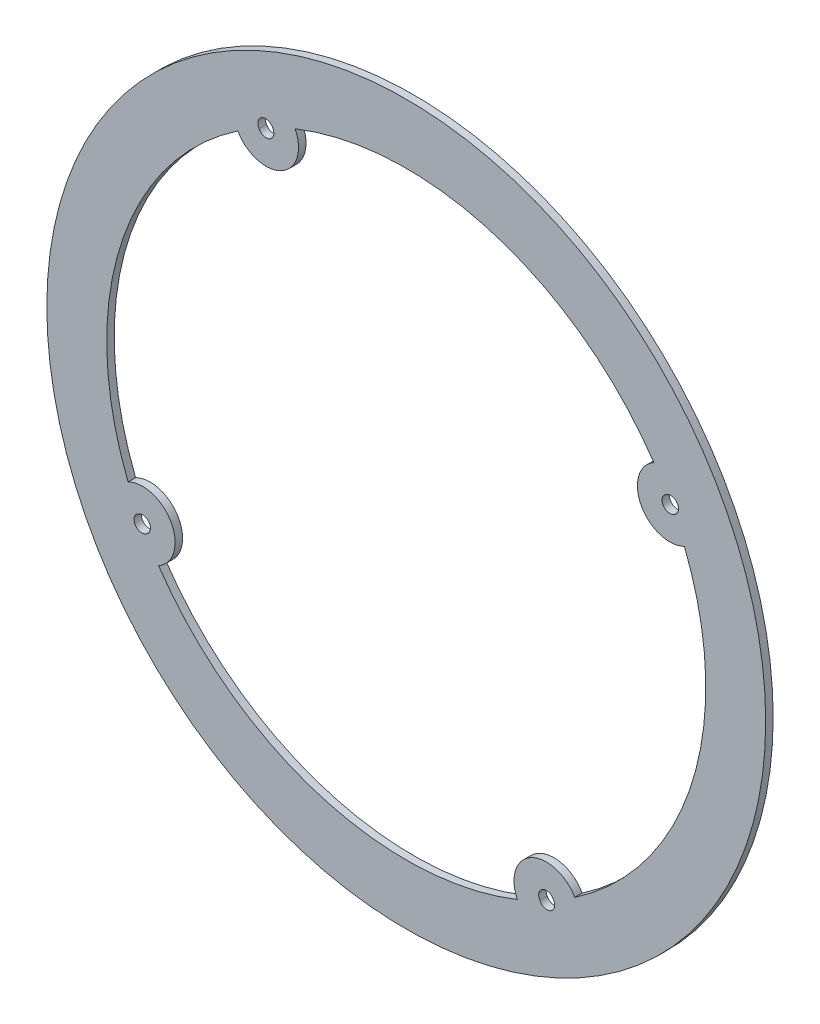
ISO-10303-21;
HEADER;
FILE_DESCRIPTION(('STEP AP214'),'2;1');
FILE_NAME('part.step','',(''),(''),'','','');
FILE_SCHEMA(('AUTOMOTIVE_DESIGN { 1 0 10303 214 1 1 1 1 }'));
ENDSEC;
DATA;
#1=APPLICATION_CONTEXT('core data for automotive mechanical design processes');
#2=APPLICATION_PROTOCOL_DEFINITION('international standard','automotive_design',2000,#1);
#3=PRODUCT_CONTEXT('',#1,'mechanical');
#4=PRODUCT('Part','Part','',(#3));
#5=PRODUCT_RELATED_PRODUCT_CATEGORY('part','',(#4));
#6=PRODUCT_DEFINITION_FORMATION('','',#4);
#7=PRODUCT_DEFINITION_CONTEXT('part definition',#1,'design');
#8=PRODUCT_DEFINITION('design','',#6,#7);
#9=PRODUCT_DEFINITION_SHAPE('','',#8);
#10=(LENGTH_UNIT() NAMED_UNIT(*) SI_UNIT(.MILLI.,.METRE.));
#11=(NAMED_UNIT(*) PLANE_ANGLE_UNIT() SI_UNIT($,.RADIAN.));
#12=(NAMED_UNIT(*) SI_UNIT($,.STERADIAN.) SOLID_ANGLE_UNIT());
#13=UNCERTAINTY_MEASURE_WITH_UNIT(LENGTH_MEASURE(1.E-05),#10,'distance_accuracy_value','');
#14=(GEOMETRIC_REPRESENTATION_CONTEXT(3) GLOBAL_UNCERTAINTY_ASSIGNED_CONTEXT((#13)) GLOBAL_UNIT_ASSIGNED_CONTEXT((#10,
#11,#12)) REPRESENTATION_CONTEXT('',''));
#15=CARTESIAN_POINT('',(0.,0.,0.));
#16=DIRECTION('',(0.,0.,1.));
#17=DIRECTION('',(1.,0.,0.));
#18=AXIS2_PLACEMENT_3D('',#15,#16,#17);
#19=CARTESIAN_POINT('',(0.,0.,1.5875));
#20=DIRECTION('',(0.,0.,-1.));
#21=DIRECTION('',(-1.,0.,0.));
#22=AXIS2_PLACEMENT_3D('',#19,#20,#21);
#23=CYLINDRICAL_SURFACE('',#22,63.5);
#24=DIRECTION('',(0.,0.,1.));
#25=VECTOR('',#24,1.);
#26=CARTESIAN_POINT('',(58.965577068711,23.5650317409907,0.79375));
#27=LINE('',#26,#25);
#28=CARTESIAN_POINT('',(58.965577068711,23.5650317409907,0.));
#29=VERTEX_POINT('',#28);
#30=CARTESIAN_POINT('',(58.965577068711,23.5650317409907,1.5875));
#31=VERTEX_POINT('',#30);
#32=EDGE_CURVE('E167',#29,#31,#27,.T.);
#33=ORIENTED_EDGE('',*,*,#32,.F.);
#34=CARTESIAN_POINT('',(0.,0.,0.));
#35=DIRECTION('',(0.,0.,1.));
#36=DIRECTION('',(1.,0.,0.));
#37=AXIS2_PLACEMENT_3D('',#34,#35,#36);
#38=CIRCLE('',#37,63.5);
#39=CARTESIAN_POINT('',(35.7161830716512,-52.5033738610415,0.));
#40=VERTEX_POINT('',#39);
#41=EDGE_CURVE('E404',#40,#29,#38,.T.);
#42=ORIENTED_EDGE('',*,*,#41,.F.);
#43=DIRECTION('',(0.,0.,1.));
#44=VECTOR('',#43,1.);
#45=CARTESIAN_POINT('',(35.7161830716512,-52.5033738610415,0.79375));
#46=LINE('',#45,#44);
#47=CARTESIAN_POINT('',(35.7161830716512,-52.5033738610415,1.5875));
#48=VERTEX_POINT('',#47);
#49=EDGE_CURVE('E287',#48,#40,#46,.F.);
#50=ORIENTED_EDGE('',*,*,#49,.F.);
#51=CARTESIAN_POINT('',(0.,0.,1.5875));
#52=DIRECTION('',(0.,0.,1.));
#53=DIRECTION('',(1.,0.,0.));
#54=AXIS2_PLACEMENT_3D('',#51,#52,#53);
#55=CIRCLE('',#54,63.5);
#56=EDGE_CURVE('E388',#48,#31,#55,.T.);
#57=ORIENTED_EDGE('',*,*,#56,.T.);
#58=EDGE_LOOP('',(#33,#42,#50,#57));
#59=FACE_BOUND('',#58,.T.);
#60=ADVANCED_FACE('F41',(#59),#23,.F.);
#61=DIRECTION('',(0.,0.,1.));
#62=VECTOR('',#61,1.);
#63=CARTESIAN_POINT('',(23.5650317409901,-58.9655770687113,0.79375));
#64=LINE('',#63,#62);
#65=CARTESIAN_POINT('',(23.5650317409901,-58.9655770687113,0.));
#66=VERTEX_POINT('',#65);
#67=CARTESIAN_POINT('',(23.5650317409901,-58.9655770687113,1.5875));
#68=VERTEX_POINT('',#67);
#69=EDGE_CURVE('E290',#66,#68,#64,.T.);
#70=ORIENTED_EDGE('',*,*,#69,.F.);
#71=CARTESIAN_POINT('',(-52.5033738610414,-35.7161830716514,0.));
#72=VERTEX_POINT('',#71);
#73=EDGE_CURVE('E258',#72,#66,#38,.T.);
#74=ORIENTED_EDGE('',*,*,#73,.F.);
#75=DIRECTION('',(0.,0.,1.));
#76=VECTOR('',#75,1.);
#77=CARTESIAN_POINT('',(-52.5033738610414,-35.7161830716514,0.79375));
#78=LINE('',#77,#76);
#79=CARTESIAN_POINT('',(-52.5033738610414,-35.7161830716514,1.5875));
#80=VERTEX_POINT('',#79);
#81=EDGE_CURVE('E281',#80,#72,#78,.F.);
#82=ORIENTED_EDGE('',*,*,#81,.F.);
#83=EDGE_CURVE('E252',#80,#68,#55,.T.);
#84=ORIENTED_EDGE('',*,*,#83,.T.);
#85=EDGE_LOOP('',(#70,#74,#82,#84));
#86=FACE_BOUND('',#85,.T.);
#87=ADVANCED_FACE('F348',(#86),#23,.F.);
#88=DIRECTION('',(0.,0.,1.));
#89=VECTOR('',#88,1.);
#90=CARTESIAN_POINT('',(-58.9655770687112,-23.5650317409903,0.79375));
#91=LINE('',#90,#89);
#92=CARTESIAN_POINT('',(-58.9655770687112,-23.5650317409903,0.));
#93=VERTEX_POINT('',#92);
#94=CARTESIAN_POINT('',(-58.9655770687112,-23.5650317409903,1.5875));
#95=VERTEX_POINT('',#94);
#96=EDGE_CURVE('E284',#93,#95,#91,.T.);
#97=ORIENTED_EDGE('',*,*,#96,.F.);
#98=CARTESIAN_POINT('',(-35.7161830716512,52.5033738610415,0.));
#99=VERTEX_POINT('',#98);
#100=EDGE_CURVE('E254',#99,#93,#38,.T.);
#101=ORIENTED_EDGE('',*,*,#100,.F.);
#102=DIRECTION('',(0.,0.,1.));
#103=VECTOR('',#102,1.);
#104=CARTESIAN_POINT('',(-35.7161830716512,52.5033738610415,0.79375));
#105=LINE('',#104,#103);
#106=CARTESIAN_POINT('',(-35.7161830716512,52.5033738610415,1.5875));
#107=VERTEX_POINT('',#106);
#108=EDGE_CURVE('E263',#107,#99,#105,.F.);
#109=ORIENTED_EDGE('',*,*,#108,.F.);
#110=EDGE_CURVE('E247',#107,#95,#55,.T.);
#111=ORIENTED_EDGE('',*,*,#110,.T.);
#112=EDGE_LOOP('',(#97,#101,#109,#111));
#113=FACE_BOUND('',#112,.T.);
#114=ADVANCED_FACE('F332',(#113),#23,.F.);
#115=CARTESIAN_POINT('',(0.,0.,1.5875));
#116=DIRECTION('',(0.,0.,1.));
#117=DIRECTION('',(1.,0.,0.));
#118=AXIS2_PLACEMENT_3D('',#115,#116,#117);
#119=PLANE('',#118);
#120=CARTESIAN_POINT('',(-56.0646446078993,-29.8161973596558,1.5875));
#121=DIRECTION('',(0.,0.,1.));
#122=DIRECTION('',(0.,1.,0.));
#123=AXIS2_PLACEMENT_3D('',#120,#121,#122);
#124=CIRCLE('',#123,1.651);
#125=CARTESIAN_POINT('',(-56.7459870389171,-28.3123444773249,1.5875));
#126=VERTEX_POINT('',#125);
#127=CARTESIAN_POINT('',(-55.1986575689822,-31.2218528823311,1.5875));
#128=VERTEX_POINT('',#127);
#129=EDGE_CURVE('E184',#126,#128,#124,.T.);
#130=ORIENTED_EDGE('',*,*,#129,.F.);
#131=CARTESIAN_POINT('',(-55.8799999999999,-29.7180000000002,1.5875));
#132=DIRECTION('',(0.,0.,1.));
#133=DIRECTION('',(0.,1.,0.));
#134=AXIS2_PLACEMENT_3D('',#131,#132,#133);
#135=CIRCLE('',#134,1.651);
#136=EDGE_CURVE('E205',#128,#126,#135,.T.);
#137=ORIENTED_EDGE('',*,*,#136,.F.);
#138=EDGE_LOOP('',(#130,#137));
#139=FACE_BOUND('',#138,.T.);
#140=CARTESIAN_POINT('',(29.8161973596556,-56.0646446078994,1.5875));
#141=DIRECTION('',(0.,0.,1.));
#142=DIRECTION('',(-1.,0.,0.));
#143=AXIS2_PLACEMENT_3D('',#140,#141,#142);
#144=CIRCLE('',#143,1.651);
#145=CARTESIAN_POINT('',(28.3123444773247,-56.7459870389171,1.5875));
#146=VERTEX_POINT('',#145);
#147=CARTESIAN_POINT('',(31.2218528823309,-55.1986575689823,1.5875));
#148=VERTEX_POINT('',#147);
#149=EDGE_CURVE('E320',#146,#148,#144,.T.);
#150=ORIENTED_EDGE('',*,*,#149,.F.);
#151=CARTESIAN_POINT('',(29.718,-55.88,1.5875));
#152=DIRECTION('',(0.,0.,1.));
#153=DIRECTION('',(-1.,0.,0.));
#154=AXIS2_PLACEMENT_3D('',#151,#152,#153);
#155=CIRCLE('',#154,1.651);
#156=EDGE_CURVE('E190',#148,#146,#155,.T.);
#157=ORIENTED_EDGE('',*,*,#156,.F.);
#158=EDGE_LOOP('',(#150,#157));
#159=FACE_BOUND('',#158,.T.);
#160=CARTESIAN_POINT('',(56.0646446078991,29.8161973596562,1.5875));
#161=DIRECTION('',(0.,0.,1.));
#162=DIRECTION('',(0.,-1.,0.));
#163=AXIS2_PLACEMENT_3D('',#160,#161,#162);
#164=CIRCLE('',#163,1.651);
#165=CARTESIAN_POINT('',(56.7459870389168,28.3123444773253,1.5875));
#166=VERTEX_POINT('',#165);
#167=CARTESIAN_POINT('',(55.198657568982,31.2218528823315,1.5875));
#168=VERTEX_POINT('',#167);
#169=EDGE_CURVE('E157',#166,#168,#164,.T.);
#170=ORIENTED_EDGE('',*,*,#169,.F.);
#171=CARTESIAN_POINT('',(55.8799999999997,29.7180000000006,1.5875));
#172=DIRECTION('',(0.,0.,1.));
#173=DIRECTION('',(0.,-1.,0.));
#174=AXIS2_PLACEMENT_3D('',#171,#172,#173);
#175=CIRCLE('',#174,1.651);
#176=EDGE_CURVE('E173',#168,#166,#175,.T.);
#177=ORIENTED_EDGE('',*,*,#176,.F.);
#178=EDGE_LOOP('',(#170,#177));
#179=FACE_BOUND('',#178,.T.);
#180=CARTESIAN_POINT('',(52.5033738610411,35.7161830716518,1.5875));
#181=VERTEX_POINT('',#180);
#182=CARTESIAN_POINT('',(-23.5650317409901,58.9655770687113,1.5875));
#183=VERTEX_POINT('',#182);
#184=EDGE_CURVE('E253',#181,#183,#55,.T.);
#185=ORIENTED_EDGE('',*,*,#184,.F.);
#186=CARTESIAN_POINT('',(55.8799999999997,29.7180000000006,1.5875));
#187=DIRECTION('',(0.,0.,1.));
#188=DIRECTION('',(0.,1.,0.));
#189=AXIS2_PLACEMENT_3D('',#186,#187,#188);
#190=CIRCLE('',#189,6.88329893607279);
#191=EDGE_CURVE('E182',#181,#31,#190,.T.);
#192=ORIENTED_EDGE('',*,*,#191,.T.);
#193=ORIENTED_EDGE('',*,*,#56,.F.);
#194=CARTESIAN_POINT('',(29.718,-55.88,1.5875));
#195=DIRECTION('',(0.,0.,1.));
#196=DIRECTION('',(1.,0.,0.));
#197=AXIS2_PLACEMENT_3D('',#194,#195,#196);
#198=CIRCLE('',#197,6.88329893607279);
#199=EDGE_CURVE('E198',#48,#68,#198,.T.);
#200=ORIENTED_EDGE('',*,*,#199,.T.);
#201=ORIENTED_EDGE('',*,*,#83,.F.);
#202=CARTESIAN_POINT('',(-55.8799999999999,-29.7180000000002,1.5875));
#203=DIRECTION('',(0.,0.,1.));
#204=DIRECTION('',(0.,-1.,0.));
#205=AXIS2_PLACEMENT_3D('',#202,#203,#204);
#206=CIRCLE('',#205,6.88329893607279);
#207=EDGE_CURVE('E213',#80,#95,#206,.T.);
#208=ORIENTED_EDGE('',*,*,#207,.T.);
#209=ORIENTED_EDGE('',*,*,#110,.F.);
#210=CARTESIAN_POINT('',(-29.718,55.88,1.5875));
#211=DIRECTION('',(0.,0.,1.));
#212=DIRECTION('',(-1.,0.,0.));
#213=AXIS2_PLACEMENT_3D('',#210,#211,#212);
#214=CIRCLE('',#213,6.88329893607279);
#215=EDGE_CURVE('E235',#107,#183,#214,.T.);
#216=ORIENTED_EDGE('',*,*,#215,.T.);
#217=EDGE_LOOP('',(#185,#192,#193,#200,#201,#208,#209,#216));
#218=FACE_BOUND('',#217,.T.);
#219=CARTESIAN_POINT('',(-29.8161973596556,56.0646446078994,1.5875));
#220=DIRECTION('',(0.,0.,1.));
#221=DIRECTION('',(1.,0.,0.));
#222=AXIS2_PLACEMENT_3D('',#219,#220,#221);
#223=CIRCLE('',#222,1.651);
#224=CARTESIAN_POINT('',(-28.3123444773247,56.7459870389171,1.5875));
#225=VERTEX_POINT('',#224);
#226=CARTESIAN_POINT('',(-31.2218528823309,55.1986575689823,1.5875));
#227=VERTEX_POINT('',#226);
#228=EDGE_CURVE('E220',#225,#227,#223,.T.);
#229=ORIENTED_EDGE('',*,*,#228,.F.);
#230=CARTESIAN_POINT('',(-29.718,55.88,1.5875));
#231=DIRECTION('',(0.,0.,1.));
#232=DIRECTION('',(1.,0.,0.));
#233=AXIS2_PLACEMENT_3D('',#230,#231,#232);
#234=CIRCLE('',#233,1.651);
#235=EDGE_CURVE('E228',#227,#225,#234,.T.);
#236=ORIENTED_EDGE('',*,*,#235,.F.);
#237=EDGE_LOOP('',(#229,#236));
#238=FACE_BOUND('',#237,.T.);
#239=CARTESIAN_POINT('',(0.,0.,1.5875));
#240=DIRECTION('',(0.,0.,1.));
#241=DIRECTION('',(1.,0.,0.));
#242=AXIS2_PLACEMENT_3D('',#239,#240,#241);
#243=CIRCLE('',#242,76.2);
#244=CARTESIAN_POINT('',(76.2,0.,1.5875));
#245=VERTEX_POINT('',#244);
#246=EDGE_CURVE('E259',#245,#245,#243,.T.);
#247=ORIENTED_EDGE('',*,*,#246,.T.);
#248=EDGE_LOOP('',(#247));
#249=FACE_BOUND('',#248,.T.);
#250=ADVANCED_FACE('F171',(#139,#159,#179,#218,#238,#249),#119,.T.);
#251=CARTESIAN_POINT('',(0.,0.,0.));
#252=DIRECTION('',(0.,0.,1.));
#253=DIRECTION('',(1.,0.,0.));
#254=AXIS2_PLACEMENT_3D('',#251,#252,#253);
#255=PLANE('',#254);
#256=CARTESIAN_POINT('',(55.8799999999997,29.7180000000006,0.));
#257=DIRECTION('',(0.,0.,1.));
#258=DIRECTION('',(0.,1.,0.));
#259=AXIS2_PLACEMENT_3D('',#256,#257,#258);
#260=CIRCLE('',#259,6.88329893607279);
#261=CARTESIAN_POINT('',(52.5033738610411,35.7161830716518,0.));
#262=VERTEX_POINT('',#261);
#263=EDGE_CURVE('E187',#262,#29,#260,.T.);
#264=ORIENTED_EDGE('',*,*,#263,.F.);
#265=CARTESIAN_POINT('',(-23.5650317409901,58.9655770687113,0.));
#266=VERTEX_POINT('',#265);
#267=EDGE_CURVE('E243',#262,#266,#38,.T.);
#268=ORIENTED_EDGE('',*,*,#267,.T.);
#269=CARTESIAN_POINT('',(-29.718,55.88,0.));
#270=DIRECTION('',(0.,0.,1.));
#271=DIRECTION('',(-1.,0.,0.));
#272=AXIS2_PLACEMENT_3D('',#269,#270,#271);
#273=CIRCLE('',#272,6.88329893607279);
#274=EDGE_CURVE('E239',#99,#266,#273,.T.);
#275=ORIENTED_EDGE('',*,*,#274,.F.);
#276=ORIENTED_EDGE('',*,*,#100,.T.);
#277=CARTESIAN_POINT('',(-55.8799999999999,-29.7180000000002,0.));
#278=DIRECTION('',(0.,0.,1.));
#279=DIRECTION('',(0.,-1.,0.));
#280=AXIS2_PLACEMENT_3D('',#277,#278,#279);
#281=CIRCLE('',#280,6.88329893607279);
#282=EDGE_CURVE('E217',#72,#93,#281,.T.);
#283=ORIENTED_EDGE('',*,*,#282,.F.);
#284=ORIENTED_EDGE('',*,*,#73,.T.);
#285=CARTESIAN_POINT('',(29.718,-55.88,0.));
#286=DIRECTION('',(0.,0.,1.));
#287=DIRECTION('',(1.,0.,0.));
#288=AXIS2_PLACEMENT_3D('',#285,#286,#287);
#289=CIRCLE('',#288,6.88329893607279);
#290=EDGE_CURVE('E202',#40,#66,#289,.T.);
#291=ORIENTED_EDGE('',*,*,#290,.F.);
#292=ORIENTED_EDGE('',*,*,#41,.T.);
#293=EDGE_LOOP('',(#264,#268,#275,#276,#283,#284,#291,#292));
#294=FACE_BOUND('',#293,.T.);
#295=CARTESIAN_POINT('',(0.,0.,0.));
#296=DIRECTION('',(0.,0.,1.));
#297=DIRECTION('',(1.,0.,0.));
#298=AXIS2_PLACEMENT_3D('',#295,#296,#297);
#299=CIRCLE('',#298,76.2);
#300=CARTESIAN_POINT('',(76.2,0.,0.));
#301=VERTEX_POINT('',#300);
#302=EDGE_CURVE('E251',#301,#301,#299,.T.);
#303=ORIENTED_EDGE('',*,*,#302,.F.);
#304=EDGE_LOOP('',(#303));
#305=FACE_BOUND('',#304,.T.);
#306=CARTESIAN_POINT('',(-29.718,55.88,0.));
#307=DIRECTION('',(0.,0.,1.));
#308=DIRECTION('',(1.,0.,0.));
#309=AXIS2_PLACEMENT_3D('',#306,#307,#308);
#310=CIRCLE('',#309,1.651);
#311=CARTESIAN_POINT('',(-31.2218528823309,55.1986575689823,0.));
#312=VERTEX_POINT('',#311);
#313=CARTESIAN_POINT('',(-28.3123444773247,56.7459870389171,0.));
#314=VERTEX_POINT('',#313);
#315=EDGE_CURVE('E231',#312,#314,#310,.T.);
#316=ORIENTED_EDGE('',*,*,#315,.T.);
#317=CARTESIAN_POINT('',(-29.8161973596556,56.0646446078994,0.));
#318=DIRECTION('',(0.,0.,1.));
#319=DIRECTION('',(1.,0.,0.));
#320=AXIS2_PLACEMENT_3D('',#317,#318,#319);
#321=CIRCLE('',#320,1.651);
#322=EDGE_CURVE('E224',#314,#312,#321,.T.);
#323=ORIENTED_EDGE('',*,*,#322,.T.);
#324=EDGE_LOOP('',(#316,#323));
#325=FACE_BOUND('',#324,.T.);
#326=CARTESIAN_POINT('',(-55.8799999999999,-29.7180000000002,0.));
#327=DIRECTION('',(0.,0.,1.));
#328=DIRECTION('',(0.,1.,0.));
#329=AXIS2_PLACEMENT_3D('',#326,#327,#328);
#330=CIRCLE('',#329,1.651);
#331=CARTESIAN_POINT('',(-55.1986575689822,-31.2218528823311,0.));
#332=VERTEX_POINT('',#331);
#333=CARTESIAN_POINT('',(-56.7459870389171,-28.3123444773249,0.));
#334=VERTEX_POINT('',#333);
#335=EDGE_CURVE('E209',#332,#334,#330,.T.);
#336=ORIENTED_EDGE('',*,*,#335,.T.);
#337=CARTESIAN_POINT('',(-56.0646446078993,-29.8161973596558,0.));
#338=DIRECTION('',(0.,0.,1.));
#339=DIRECTION('',(0.,1.,0.));
#340=AXIS2_PLACEMENT_3D('',#337,#338,#339);
#341=CIRCLE('',#340,1.651);
#342=EDGE_CURVE('E57',#334,#332,#341,.T.);
#343=ORIENTED_EDGE('',*,*,#342,.T.);
#344=EDGE_LOOP('',(#336,#343));
#345=FACE_BOUND('',#344,.T.);
#346=CARTESIAN_POINT('',(29.718,-55.88,0.));
#347=DIRECTION('',(0.,0.,1.));
#348=DIRECTION('',(-1.,0.,0.));
#349=AXIS2_PLACEMENT_3D('',#346,#347,#348);
#350=CIRCLE('',#349,1.651);
#351=CARTESIAN_POINT('',(31.2218528823309,-55.1986575689823,0.));
#352=VERTEX_POINT('',#351);
#353=CARTESIAN_POINT('',(28.3123444773247,-56.7459870389171,0.));
#354=VERTEX_POINT('',#353);
#355=EDGE_CURVE('E194',#352,#354,#350,.T.);
#356=ORIENTED_EDGE('',*,*,#355,.T.);
#357=CARTESIAN_POINT('',(29.8161973596556,-56.0646446078994,0.));
#358=DIRECTION('',(0.,0.,1.));
#359=DIRECTION('',(-1.,0.,0.));
#360=AXIS2_PLACEMENT_3D('',#357,#358,#359);
#361=CIRCLE('',#360,1.651);
#362=EDGE_CURVE('E65',#354,#352,#361,.T.);
#363=ORIENTED_EDGE('',*,*,#362,.T.);
#364=EDGE_LOOP('',(#356,#363));
#365=FACE_BOUND('',#364,.T.);
#366=CARTESIAN_POINT('',(55.8799999999997,29.7180000000006,0.));
#367=DIRECTION('',(0.,0.,1.));
#368=DIRECTION('',(0.,-1.,0.));
#369=AXIS2_PLACEMENT_3D('',#366,#367,#368);
#370=CIRCLE('',#369,1.651);
#371=CARTESIAN_POINT('',(55.198657568982,31.2218528823315,0.));
#372=VERTEX_POINT('',#371);
#373=CARTESIAN_POINT('',(56.7459870389168,28.3123444773253,0.));
#374=VERTEX_POINT('',#373);
#375=EDGE_CURVE('E178',#372,#374,#370,.T.);
#376=ORIENTED_EDGE('',*,*,#375,.T.);
#377=CARTESIAN_POINT('',(56.0646446078991,29.8161973596562,0.));
#378=DIRECTION('',(0.,0.,1.));
#379=DIRECTION('',(0.,-1.,0.));
#380=AXIS2_PLACEMENT_3D('',#377,#378,#379);
#381=CIRCLE('',#380,1.651);
#382=EDGE_CURVE('E160',#374,#372,#381,.T.);
#383=ORIENTED_EDGE('',*,*,#382,.T.);
#384=EDGE_LOOP('',(#376,#383));
#385=FACE_BOUND('',#384,.T.);
#386=ADVANCED_FACE('F313',(#294,#305,#325,#345,#365,#385),#255,.F.);
#387=CARTESIAN_POINT('',(0.,0.,1.5875));
#388=DIRECTION('',(0.,0.,-1.));
#389=DIRECTION('',(-1.,0.,0.));
#390=AXIS2_PLACEMENT_3D('',#387,#388,#389);
#391=CYLINDRICAL_SURFACE('',#390,76.2);
#392=ORIENTED_EDGE('',*,*,#246,.F.);
#393=EDGE_LOOP('',(#392));
#394=FACE_BOUND('',#393,.T.);
#395=ORIENTED_EDGE('',*,*,#302,.T.);
#396=EDGE_LOOP('',(#395));
#397=FACE_BOUND('',#396,.T.);
#398=ADVANCED_FACE('F43',(#394,#397),#391,.T.);
#399=DIRECTION('',(0.,0.,1.));
#400=VECTOR('',#399,1.);
#401=CARTESIAN_POINT('',(52.5033738610411,35.7161830716517,0.79375));
#402=LINE('',#401,#400);
#403=EDGE_CURVE('E293',#181,#262,#402,.F.);
#404=ORIENTED_EDGE('',*,*,#403,.F.);
#405=ORIENTED_EDGE('',*,*,#184,.T.);
#406=DIRECTION('',(0.,0.,1.));
#407=VECTOR('',#406,1.);
#408=CARTESIAN_POINT('',(-23.5650317409901,58.9655770687113,0.79375));
#409=LINE('',#408,#407);
#410=EDGE_CURVE('E269',#266,#183,#409,.T.);
#411=ORIENTED_EDGE('',*,*,#410,.F.);
#412=ORIENTED_EDGE('',*,*,#267,.F.);
#413=EDGE_LOOP('',(#404,#405,#411,#412));
#414=FACE_BOUND('',#413,.T.);
#415=ADVANCED_FACE('F351',(#414),#23,.F.);
#416=CARTESIAN_POINT('',(-29.718,55.88,0.));
#417=DIRECTION('',(0.,0.,1.));
#418=DIRECTION('',(1.,0.,0.));
#419=AXIS2_PLACEMENT_3D('',#416,#417,#418);
#420=CYLINDRICAL_SURFACE('',#419,6.88329893607279);
#421=ORIENTED_EDGE('',*,*,#274,.T.);
#422=ORIENTED_EDGE('',*,*,#410,.T.);
#423=ORIENTED_EDGE('',*,*,#215,.F.);
#424=ORIENTED_EDGE('',*,*,#108,.T.);
#425=EDGE_LOOP('',(#421,#422,#423,#424));
#426=FACE_BOUND('',#425,.T.);
#427=ADVANCED_FACE('F359',(#426),#420,.T.);
#428=CARTESIAN_POINT('',(-29.718,55.88,0.));
#429=DIRECTION('',(0.,0.,1.));
#430=DIRECTION('',(1.,0.,0.));
#431=AXIS2_PLACEMENT_3D('',#428,#429,#430);
#432=CYLINDRICAL_SURFACE('',#431,1.651);
#433=ORIENTED_EDGE('',*,*,#315,.F.);
#434=DIRECTION('',(0.,0.,1.));
#435=VECTOR('',#434,1.);
#436=CARTESIAN_POINT('',(-31.2218528823309,55.1986575689823,0.79375));
#437=LINE('',#436,#435);
#438=EDGE_CURVE('E277',#312,#227,#437,.T.);
#439=ORIENTED_EDGE('',*,*,#438,.T.);
#440=ORIENTED_EDGE('',*,*,#235,.T.);
#441=DIRECTION('',(0.,0.,1.));
#442=VECTOR('',#441,1.);
#443=CARTESIAN_POINT('',(-28.3123444773247,56.7459870389171,0.79375));
#444=LINE('',#443,#442);
#445=EDGE_CURVE('E273',#225,#314,#444,.F.);
#446=ORIENTED_EDGE('',*,*,#445,.T.);
#447=EDGE_LOOP('',(#433,#439,#440,#446));
#448=FACE_BOUND('',#447,.T.);
#449=ADVANCED_FACE('F365',(#448),#432,.F.);
#450=CARTESIAN_POINT('',(-29.8161973596556,56.0646446078994,0.));
#451=DIRECTION('',(0.,0.,1.));
#452=DIRECTION('',(1.,0.,0.));
#453=AXIS2_PLACEMENT_3D('',#450,#451,#452);
#454=CYLINDRICAL_SURFACE('',#453,1.651);
#455=ORIENTED_EDGE('',*,*,#322,.F.);
#456=ORIENTED_EDGE('',*,*,#445,.F.);
#457=ORIENTED_EDGE('',*,*,#228,.T.);
#458=ORIENTED_EDGE('',*,*,#438,.F.);
#459=EDGE_LOOP('',(#455,#456,#457,#458));
#460=FACE_BOUND('',#459,.T.);
#461=ADVANCED_FACE('F426',(#460),#454,.F.);
#462=CARTESIAN_POINT('',(-55.8799999999999,-29.7180000000002,0.));
#463=DIRECTION('',(0.,0.,1.));
#464=DIRECTION('',(1.,0.,0.));
#465=AXIS2_PLACEMENT_3D('',#462,#463,#464);
#466=CYLINDRICAL_SURFACE('',#465,6.88329893607279);
#467=ORIENTED_EDGE('',*,*,#282,.T.);
#468=ORIENTED_EDGE('',*,*,#96,.T.);
#469=ORIENTED_EDGE('',*,*,#207,.F.);
#470=ORIENTED_EDGE('',*,*,#81,.T.);
#471=EDGE_LOOP('',(#467,#468,#469,#470));
#472=FACE_BOUND('',#471,.T.);
#473=ADVANCED_FACE('F423',(#472),#466,.T.);
#474=CARTESIAN_POINT('',(-55.8799999999999,-29.7180000000002,0.));
#475=DIRECTION('',(0.,0.,1.));
#476=DIRECTION('',(1.,0.,0.));
#477=AXIS2_PLACEMENT_3D('',#474,#475,#476);
#478=CYLINDRICAL_SURFACE('',#477,1.651);
#479=ORIENTED_EDGE('',*,*,#335,.F.);
#480=DIRECTION('',(0.,0.,1.));
#481=VECTOR('',#480,1.);
#482=CARTESIAN_POINT('',(-55.1986575689822,-31.2218528823311,0.79375));
#483=LINE('',#482,#481);
#484=EDGE_CURVE('E11',#332,#128,#483,.T.);
#485=ORIENTED_EDGE('',*,*,#484,.T.);
#486=ORIENTED_EDGE('',*,*,#136,.T.);
#487=DIRECTION('',(0.,0.,1.));
#488=VECTOR('',#487,1.);
#489=CARTESIAN_POINT('',(-56.7459870389171,-28.3123444773249,0.79375));
#490=LINE('',#489,#488);
#491=EDGE_CURVE('E50',#126,#334,#490,.F.);
#492=ORIENTED_EDGE('',*,*,#491,.T.);
#493=EDGE_LOOP('',(#479,#485,#486,#492));
#494=FACE_BOUND('',#493,.T.);
#495=ADVANCED_FACE('F309',(#494),#478,.F.);
#496=CARTESIAN_POINT('',(29.718,-55.88,0.));
#497=DIRECTION('',(0.,0.,1.));
#498=DIRECTION('',(1.,0.,0.));
#499=AXIS2_PLACEMENT_3D('',#496,#497,#498);
#500=CYLINDRICAL_SURFACE('',#499,6.88329893607279);
#501=ORIENTED_EDGE('',*,*,#290,.T.);
#502=ORIENTED_EDGE('',*,*,#69,.T.);
#503=ORIENTED_EDGE('',*,*,#199,.F.);
#504=ORIENTED_EDGE('',*,*,#49,.T.);
#505=EDGE_LOOP('',(#501,#502,#503,#504));
#506=FACE_BOUND('',#505,.T.);
#507=ADVANCED_FACE('F400',(#506),#500,.T.);
#508=CARTESIAN_POINT('',(29.718,-55.88,0.));
#509=DIRECTION('',(0.,0.,1.));
#510=DIRECTION('',(1.,0.,0.));
#511=AXIS2_PLACEMENT_3D('',#508,#509,#510);
#512=CYLINDRICAL_SURFACE('',#511,1.651);
#513=ORIENTED_EDGE('',*,*,#355,.F.);
#514=DIRECTION('',(0.,0.,1.));
#515=VECTOR('',#514,1.);
#516=CARTESIAN_POINT('',(31.2218528823309,-55.1986575689823,0.79375));
#517=LINE('',#516,#515);
#518=EDGE_CURVE('E303',#352,#148,#517,.T.);
#519=ORIENTED_EDGE('',*,*,#518,.T.);
#520=ORIENTED_EDGE('',*,*,#156,.T.);
#521=DIRECTION('',(0.,0.,1.));
#522=VECTOR('',#521,1.);
#523=CARTESIAN_POINT('',(28.3123444773247,-56.7459870389171,0.79375));
#524=LINE('',#523,#522);
#525=EDGE_CURVE('E300',#146,#354,#524,.F.);
#526=ORIENTED_EDGE('',*,*,#525,.T.);
#527=EDGE_LOOP('',(#513,#519,#520,#526));
#528=FACE_BOUND('',#527,.T.);
#529=ADVANCED_FACE('F337',(#528),#512,.F.);
#530=CARTESIAN_POINT('',(55.8799999999997,29.7180000000006,0.));
#531=DIRECTION('',(0.,0.,1.));
#532=DIRECTION('',(1.,0.,0.));
#533=AXIS2_PLACEMENT_3D('',#530,#531,#532);
#534=CYLINDRICAL_SURFACE('',#533,6.88329893607279);
#535=ORIENTED_EDGE('',*,*,#263,.T.);
#536=ORIENTED_EDGE('',*,*,#32,.T.);
#537=ORIENTED_EDGE('',*,*,#191,.F.);
#538=ORIENTED_EDGE('',*,*,#403,.T.);
#539=EDGE_LOOP('',(#535,#536,#537,#538));
#540=FACE_BOUND('',#539,.T.);
#541=ADVANCED_FACE('F409',(#540),#534,.T.);
#542=CARTESIAN_POINT('',(55.8799999999997,29.7180000000006,0.));
#543=DIRECTION('',(0.,0.,1.));
#544=DIRECTION('',(1.,0.,0.));
#545=AXIS2_PLACEMENT_3D('',#542,#543,#544);
#546=CYLINDRICAL_SURFACE('',#545,1.651);
#547=ORIENTED_EDGE('',*,*,#375,.F.);
#548=DIRECTION('',(0.,0.,1.));
#549=VECTOR('',#548,1.);
#550=CARTESIAN_POINT('',(55.198657568982,31.2218528823315,0.79375));
#551=LINE('',#550,#549);
#552=EDGE_CURVE('E166',#372,#168,#551,.T.);
#553=ORIENTED_EDGE('',*,*,#552,.T.);
#554=ORIENTED_EDGE('',*,*,#176,.T.);
#555=DIRECTION('',(0.,0.,1.));
#556=VECTOR('',#555,1.);
#557=CARTESIAN_POINT('',(56.7459870389168,28.3123444773253,0.79375));
#558=LINE('',#557,#556);
#559=EDGE_CURVE('E154',#166,#374,#558,.F.);
#560=ORIENTED_EDGE('',*,*,#559,.T.);
#561=EDGE_LOOP('',(#547,#553,#554,#560));
#562=FACE_BOUND('',#561,.T.);
#563=ADVANCED_FACE('F176',(#562),#546,.F.);
#564=CARTESIAN_POINT('',(56.0646446078991,29.8161973596562,0.));
#565=DIRECTION('',(0.,0.,1.));
#566=DIRECTION('',(1.,0.,0.));
#567=AXIS2_PLACEMENT_3D('',#564,#565,#566);
#568=CYLINDRICAL_SURFACE('',#567,1.651);
#569=ORIENTED_EDGE('',*,*,#382,.F.);
#570=ORIENTED_EDGE('',*,*,#559,.F.);
#571=ORIENTED_EDGE('',*,*,#169,.T.);
#572=ORIENTED_EDGE('',*,*,#552,.F.);
#573=EDGE_LOOP('',(#569,#570,#571,#572));
#574=FACE_BOUND('',#573,.T.);
#575=ADVANCED_FACE('F156',(#574),#568,.F.);
#576=CARTESIAN_POINT('',(29.8161973596556,-56.0646446078994,0.));
#577=DIRECTION('',(0.,0.,1.));
#578=DIRECTION('',(1.,0.,0.));
#579=AXIS2_PLACEMENT_3D('',#576,#577,#578);
#580=CYLINDRICAL_SURFACE('',#579,1.651);
#581=ORIENTED_EDGE('',*,*,#362,.F.);
#582=ORIENTED_EDGE('',*,*,#525,.F.);
#583=ORIENTED_EDGE('',*,*,#149,.T.);
#584=ORIENTED_EDGE('',*,*,#518,.F.);
#585=EDGE_LOOP('',(#581,#582,#583,#584));
#586=FACE_BOUND('',#585,.T.);
#587=ADVANCED_FACE('F338',(#586),#580,.F.);
#588=CARTESIAN_POINT('',(-56.0646446078993,-29.8161973596558,0.));
#589=DIRECTION('',(0.,0.,1.));
#590=DIRECTION('',(1.,0.,0.));
#591=AXIS2_PLACEMENT_3D('',#588,#589,#590);
#592=CYLINDRICAL_SURFACE('',#591,1.651);
#593=ORIENTED_EDGE('',*,*,#342,.F.);
#594=ORIENTED_EDGE('',*,*,#491,.F.);
#595=ORIENTED_EDGE('',*,*,#129,.T.);
#596=ORIENTED_EDGE('',*,*,#484,.F.);
#597=EDGE_LOOP('',(#593,#594,#595,#596));
#598=FACE_BOUND('',#597,.T.);
#599=ADVANCED_FACE('F328',(#598),#592,.F.);
#600=CLOSED_SHELL('',(#60,#87,#114,#250,#386,#398,#415,#427,#449,#461,#473,#495,#507,#529,#541,
#563,#575,#587,#599));
#601=MANIFOLD_SOLID_BREP('B2',#600);
#602=ADVANCED_BREP_SHAPE_REPRESENTATION('',(#18,#601),#14);
#603=SHAPE_DEFINITION_REPRESENTATION(#9,#602);
ENDSEC;
END-ISO-10303-21;
